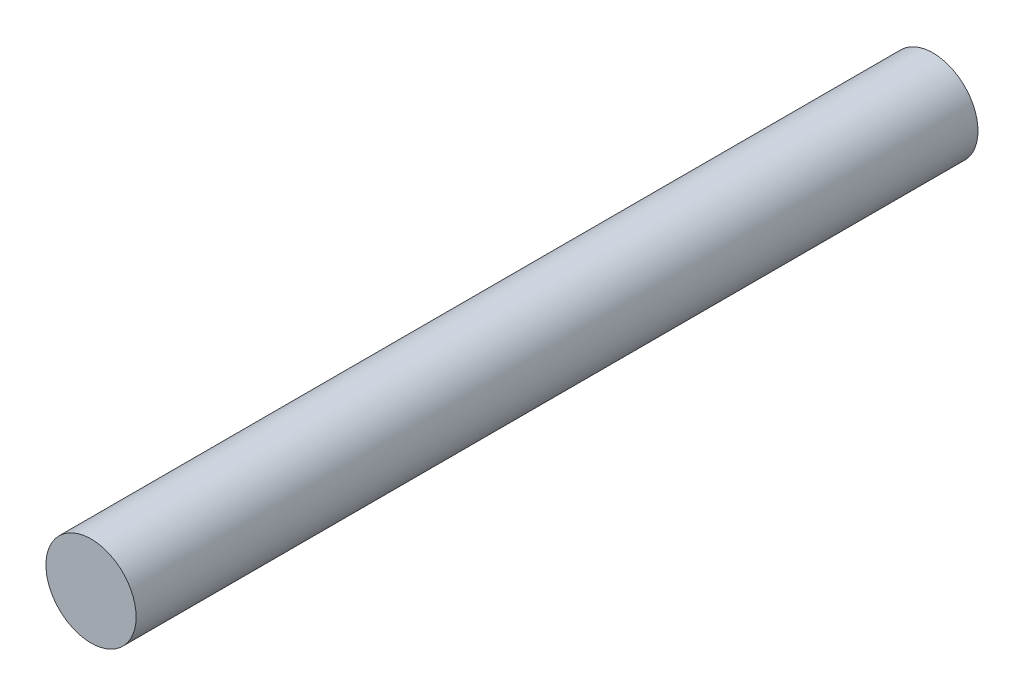
ISO-10303-21;
HEADER;
FILE_DESCRIPTION(('STEP AP214'),'2;1');
FILE_NAME('part.step','',(''),(''),'','','');
FILE_SCHEMA(('AUTOMOTIVE_DESIGN { 1 0 10303 214 1 1 1 1 }'));
ENDSEC;
DATA;
#1=APPLICATION_CONTEXT('core data for automotive mechanical design processes');
#2=APPLICATION_PROTOCOL_DEFINITION('international standard','automotive_design',2000,#1);
#3=PRODUCT_CONTEXT('',#1,'mechanical');
#4=PRODUCT('Part','Part','',(#3));
#5=PRODUCT_RELATED_PRODUCT_CATEGORY('part','',(#4));
#6=PRODUCT_DEFINITION_FORMATION('','',#4);
#7=PRODUCT_DEFINITION_CONTEXT('part definition',#1,'design');
#8=PRODUCT_DEFINITION('design','',#6,#7);
#9=PRODUCT_DEFINITION_SHAPE('','',#8);
#10=(LENGTH_UNIT() NAMED_UNIT(*) SI_UNIT(.MILLI.,.METRE.));
#11=(NAMED_UNIT(*) PLANE_ANGLE_UNIT() SI_UNIT($,.RADIAN.));
#12=(NAMED_UNIT(*) SI_UNIT($,.STERADIAN.) SOLID_ANGLE_UNIT());
#13=UNCERTAINTY_MEASURE_WITH_UNIT(LENGTH_MEASURE(1.E-05),#10,'distance_accuracy_value','');
#14=(GEOMETRIC_REPRESENTATION_CONTEXT(3) GLOBAL_UNCERTAINTY_ASSIGNED_CONTEXT((#13)) GLOBAL_UNIT_ASSIGNED_CONTEXT((#10,
#11,#12)) REPRESENTATION_CONTEXT('',''));
#15=CARTESIAN_POINT('',(0.,0.,0.));
#16=DIRECTION('',(0.,0.,1.));
#17=DIRECTION('',(1.,0.,0.));
#18=AXIS2_PLACEMENT_3D('',#15,#16,#17);
#19=CARTESIAN_POINT('',(0.,0.,28.));
#20=DIRECTION('',(0.,0.,-1.));
#21=DIRECTION('',(-1.,0.,0.));
#22=AXIS2_PLACEMENT_3D('',#19,#20,#21);
#23=CYLINDRICAL_SURFACE('',#22,1.5);
#24=CARTESIAN_POINT('',(0.,0.,28.));
#25=DIRECTION('',(0.,0.,1.));
#26=DIRECTION('',(1.,0.,0.));
#27=AXIS2_PLACEMENT_3D('',#24,#25,#26);
#28=CIRCLE('',#27,1.5);
#29=CARTESIAN_POINT('',(1.5,0.,28.));
#30=VERTEX_POINT('',#29);
#31=EDGE_CURVE('E10',#30,#30,#28,.T.);
#32=ORIENTED_EDGE('',*,*,#31,.F.);
#33=EDGE_LOOP('',(#32));
#34=FACE_BOUND('',#33,.T.);
#35=CARTESIAN_POINT('',(0.,0.,0.));
#36=DIRECTION('',(0.,0.,1.));
#37=DIRECTION('',(1.,0.,0.));
#38=AXIS2_PLACEMENT_3D('',#35,#36,#37);
#39=CIRCLE('',#38,1.5);
#40=CARTESIAN_POINT('',(1.5,0.,0.));
#41=VERTEX_POINT('',#40);
#42=EDGE_CURVE('E33',#41,#41,#39,.T.);
#43=ORIENTED_EDGE('',*,*,#42,.T.);
#44=EDGE_LOOP('',(#43));
#45=FACE_BOUND('',#44,.T.);
#46=ADVANCED_FACE('F30',(#34,#45),#23,.T.);
#47=CARTESIAN_POINT('',(0.,0.,28.));
#48=DIRECTION('',(0.,0.,1.));
#49=DIRECTION('',(1.,0.,0.));
#50=AXIS2_PLACEMENT_3D('',#47,#48,#49);
#51=PLANE('',#50);
#52=ORIENTED_EDGE('',*,*,#31,.T.);
#53=EDGE_LOOP('',(#52));
#54=FACE_BOUND('',#53,.T.);
#55=ADVANCED_FACE('F45',(#54),#51,.T.);
#56=CARTESIAN_POINT('',(0.,0.,0.));
#57=DIRECTION('',(0.,0.,1.));
#58=DIRECTION('',(1.,0.,0.));
#59=AXIS2_PLACEMENT_3D('',#56,#57,#58);
#60=PLANE('',#59);
#61=ORIENTED_EDGE('',*,*,#42,.F.);
#62=EDGE_LOOP('',(#61));
#63=FACE_BOUND('',#62,.T.);
#64=ADVANCED_FACE('F43',(#63),#60,.F.);
#65=CLOSED_SHELL('',(#46,#55,#64));
#66=MANIFOLD_SOLID_BREP('B2',#65);
#67=ADVANCED_BREP_SHAPE_REPRESENTATION('',(#18,#66),#14);
#68=SHAPE_DEFINITION_REPRESENTATION(#9,#67);
ENDSEC;
END-ISO-10303-21;
